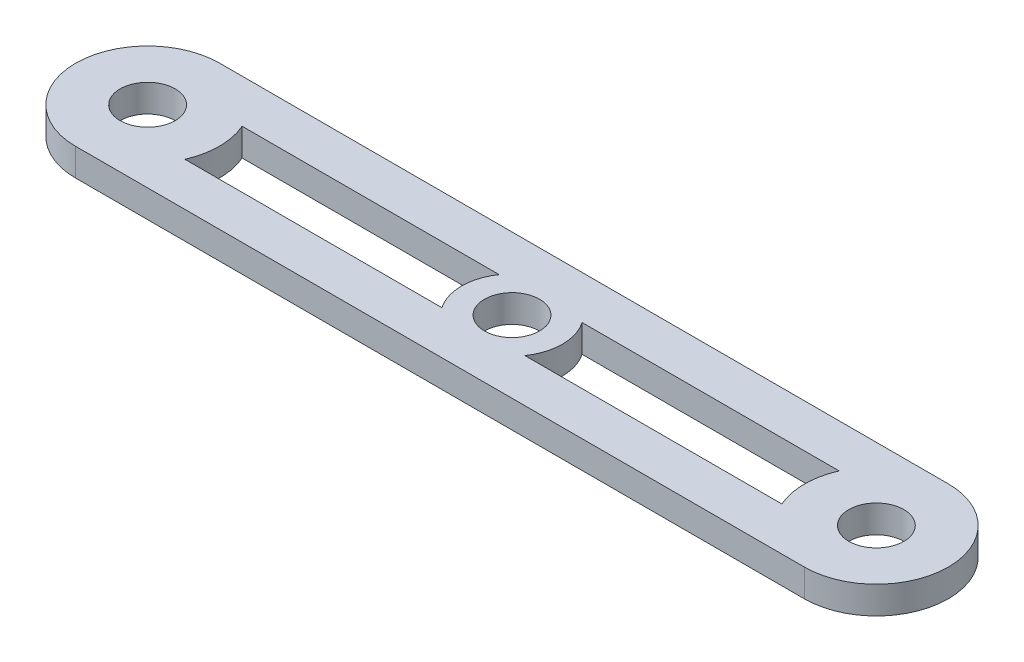
ISO-10303-21;
HEADER;
FILE_DESCRIPTION(('STEP AP214'),'2;1');
FILE_NAME('part.step','',(''),(''),'','','');
FILE_SCHEMA(('AUTOMOTIVE_DESIGN { 1 0 10303 214 1 1 1 1 }'));
ENDSEC;
DATA;
#1=APPLICATION_CONTEXT('core data for automotive mechanical design processes');
#2=APPLICATION_PROTOCOL_DEFINITION('international standard','automotive_design',2000,#1);
#3=PRODUCT_CONTEXT('',#1,'mechanical');
#4=PRODUCT('Part','Part','',(#3));
#5=PRODUCT_RELATED_PRODUCT_CATEGORY('part','',(#4));
#6=PRODUCT_DEFINITION_FORMATION('','',#4);
#7=PRODUCT_DEFINITION_CONTEXT('part definition',#1,'design');
#8=PRODUCT_DEFINITION('design','',#6,#7);
#9=PRODUCT_DEFINITION_SHAPE('','',#8);
#10=(LENGTH_UNIT() NAMED_UNIT(*) SI_UNIT(.MILLI.,.METRE.));
#11=(NAMED_UNIT(*) PLANE_ANGLE_UNIT() SI_UNIT($,.RADIAN.));
#12=(NAMED_UNIT(*) SI_UNIT($,.STERADIAN.) SOLID_ANGLE_UNIT());
#13=UNCERTAINTY_MEASURE_WITH_UNIT(LENGTH_MEASURE(1.E-05),#10,'distance_accuracy_value','');
#14=(GEOMETRIC_REPRESENTATION_CONTEXT(3) GLOBAL_UNCERTAINTY_ASSIGNED_CONTEXT((#13)) GLOBAL_UNIT_ASSIGNED_CONTEXT((#10,
#11,#12)) REPRESENTATION_CONTEXT('',''));
#15=CARTESIAN_POINT('',(0.,0.,0.));
#16=DIRECTION('',(0.,0.,1.));
#17=DIRECTION('',(1.,0.,0.));
#18=AXIS2_PLACEMENT_3D('',#15,#16,#17);
#19=CARTESIAN_POINT('',(0.,0.79375,1.65));
#20=DIRECTION('',(0.,0.,-1.));
#21=DIRECTION('',(-1.,0.,0.));
#22=AXIS2_PLACEMENT_3D('',#19,#20,#21);
#23=PLANE('',#22);
#24=DIRECTION('',(1.,0.,0.));
#25=VECTOR('',#24,1.);
#26=CARTESIAN_POINT('',(0.,-0.79375,1.65));
#27=LINE('',#26,#25);
#28=CARTESIAN_POINT('',(2.3905876376198,-0.79375,1.65));
#29=VERTEX_POINT('',#28);
#30=CARTESIAN_POINT('',(17.2028060915049,-0.79375,1.65));
#31=VERTEX_POINT('',#30);
#32=EDGE_CURVE('E184',#29,#31,#27,.T.);
#33=ORIENTED_EDGE('',*,*,#32,.F.);
#34=DIRECTION('',(0.,-1.,0.));
#35=VECTOR('',#34,1.);
#36=CARTESIAN_POINT('',(2.3905876376198,0.79375,1.65));
#37=LINE('',#36,#35);
#38=CARTESIAN_POINT('',(2.3905876376198,0.79375,1.65));
#39=VERTEX_POINT('',#38);
#40=EDGE_CURVE('E11',#39,#29,#37,.T.);
#41=ORIENTED_EDGE('',*,*,#40,.F.);
#42=DIRECTION('',(1.,0.,0.));
#43=VECTOR('',#42,1.);
#44=CARTESIAN_POINT('',(0.,0.79375,1.65));
#45=LINE('',#44,#43);
#46=CARTESIAN_POINT('',(17.2028060915049,0.79375,1.65));
#47=VERTEX_POINT('',#46);
#48=EDGE_CURVE('E137',#39,#47,#45,.T.);
#49=ORIENTED_EDGE('',*,*,#48,.T.);
#50=DIRECTION('',(0.,-1.,0.));
#51=VECTOR('',#50,1.);
#52=CARTESIAN_POINT('',(17.2028060915049,0.79375,1.65));
#53=LINE('',#52,#51);
#54=EDGE_CURVE('E99',#47,#31,#53,.T.);
#55=ORIENTED_EDGE('',*,*,#54,.T.);
#56=EDGE_LOOP('',(#33,#41,#49,#55));
#57=FACE_BOUND('',#56,.T.);
#58=ADVANCED_FACE('F34',(#57),#23,.T.);
#59=CARTESIAN_POINT('',(0.,0.79375,0.));
#60=DIRECTION('',(0.,-1.,0.));
#61=DIRECTION('',(0.,0.,-1.));
#62=AXIS2_PLACEMENT_3D('',#59,#60,#61);
#63=CYLINDRICAL_SURFACE('',#62,2.90472188912133);
#64=CARTESIAN_POINT('',(0.,-0.79375,0.));
#65=DIRECTION('',(0.,1.,0.));
#66=DIRECTION('',(0.,0.,1.));
#67=AXIS2_PLACEMENT_3D('',#64,#65,#66);
#68=CIRCLE('',#67,2.90472188912133);
#69=CARTESIAN_POINT('',(2.3905876376198,-0.79375,-1.65));
#70=VERTEX_POINT('',#69);
#71=EDGE_CURVE('E143',#29,#70,#68,.T.);
#72=ORIENTED_EDGE('',*,*,#71,.T.);
#73=DIRECTION('',(0.,-1.,0.));
#74=VECTOR('',#73,1.);
#75=CARTESIAN_POINT('',(2.3905876376198,0.79375,-1.65));
#76=LINE('',#75,#74);
#77=CARTESIAN_POINT('',(2.3905876376198,0.79375,-1.65));
#78=VERTEX_POINT('',#77);
#79=EDGE_CURVE('E44',#78,#70,#76,.T.);
#80=ORIENTED_EDGE('',*,*,#79,.F.);
#81=CARTESIAN_POINT('',(0.,0.79375,0.));
#82=DIRECTION('',(0.,1.,0.));
#83=DIRECTION('',(0.,0.,1.));
#84=AXIS2_PLACEMENT_3D('',#81,#82,#83);
#85=CIRCLE('',#84,2.90472188912133);
#86=EDGE_CURVE('E132',#39,#78,#85,.T.);
#87=ORIENTED_EDGE('',*,*,#86,.F.);
#88=ORIENTED_EDGE('',*,*,#40,.T.);
#89=EDGE_LOOP('',(#72,#80,#87,#88));
#90=FACE_BOUND('',#89,.T.);
#91=ADVANCED_FACE('F141',(#90),#63,.T.);
#92=CARTESIAN_POINT('',(0.,0.79375,-1.65));
#93=DIRECTION('',(0.,0.,1.));
#94=DIRECTION('',(1.,0.,0.));
#95=AXIS2_PLACEMENT_3D('',#92,#93,#94);
#96=PLANE('',#95);
#97=DIRECTION('',(-1.,0.,0.));
#98=VECTOR('',#97,1.);
#99=CARTESIAN_POINT('',(0.,-0.79375,-1.65));
#100=LINE('',#99,#98);
#101=CARTESIAN_POINT('',(17.2028060915049,-0.79375,-1.65));
#102=VERTEX_POINT('',#101);
#103=EDGE_CURVE('E188',#102,#70,#100,.T.);
#104=ORIENTED_EDGE('',*,*,#103,.F.);
#105=DIRECTION('',(0.,-1.,0.));
#106=VECTOR('',#105,1.);
#107=CARTESIAN_POINT('',(17.2028060915049,0.79375,-1.65));
#108=LINE('',#107,#106);
#109=CARTESIAN_POINT('',(17.2028060915049,0.79375,-1.65));
#110=VERTEX_POINT('',#109);
#111=EDGE_CURVE('E92',#110,#102,#108,.T.);
#112=ORIENTED_EDGE('',*,*,#111,.F.);
#113=DIRECTION('',(-1.,0.,0.));
#114=VECTOR('',#113,1.);
#115=CARTESIAN_POINT('',(0.,0.79375,-1.65));
#116=LINE('',#115,#114);
#117=EDGE_CURVE('E136',#110,#78,#116,.T.);
#118=ORIENTED_EDGE('',*,*,#117,.T.);
#119=ORIENTED_EDGE('',*,*,#79,.T.);
#120=EDGE_LOOP('',(#104,#112,#118,#119));
#121=FACE_BOUND('',#120,.T.);
#122=ADVANCED_FACE('F148',(#121),#96,.T.);
#123=CARTESIAN_POINT('',(0.,0.79375,4.15));
#124=DIRECTION('',(0.,0.,-1.));
#125=DIRECTION('',(-1.,0.,0.));
#126=AXIS2_PLACEMENT_3D('',#123,#124,#125);
#127=PLANE('',#126);
#128=DIRECTION('',(1.,0.,0.));
#129=VECTOR('',#128,1.);
#130=CARTESIAN_POINT('',(0.,-0.79375,4.15));
#131=LINE('',#130,#129);
#132=CARTESIAN_POINT('',(-21.,-0.79375,4.14999999999999));
#133=VERTEX_POINT('',#132);
#134=CARTESIAN_POINT('',(21.,-0.79375,4.15));
#135=VERTEX_POINT('',#134);
#136=EDGE_CURVE('E175',#133,#135,#131,.T.);
#137=ORIENTED_EDGE('',*,*,#136,.T.);
#138=DIRECTION('',(0.,-1.,0.));
#139=VECTOR('',#138,1.);
#140=CARTESIAN_POINT('',(21.,0.79375,4.15));
#141=LINE('',#140,#139);
#142=CARTESIAN_POINT('',(21.,0.79375,4.15));
#143=VERTEX_POINT('',#142);
#144=EDGE_CURVE('E194',#143,#135,#141,.T.);
#145=ORIENTED_EDGE('',*,*,#144,.F.);
#146=DIRECTION('',(1.,0.,0.));
#147=VECTOR('',#146,1.);
#148=CARTESIAN_POINT('',(0.,0.79375,4.15));
#149=LINE('',#148,#147);
#150=CARTESIAN_POINT('',(-21.,0.79375,4.14999999999999));
#151=VERTEX_POINT('',#150);
#152=EDGE_CURVE('E388',#151,#143,#149,.T.);
#153=ORIENTED_EDGE('',*,*,#152,.F.);
#154=DIRECTION('',(0.,-1.,0.));
#155=VECTOR('',#154,1.);
#156=CARTESIAN_POINT('',(-21.,0.79375,4.14999999999999));
#157=LINE('',#156,#155);
#158=EDGE_CURVE('E196',#151,#133,#157,.T.);
#159=ORIENTED_EDGE('',*,*,#158,.T.);
#160=EDGE_LOOP('',(#137,#145,#153,#159));
#161=FACE_BOUND('',#160,.T.);
#162=ADVANCED_FACE('F256',(#161),#127,.F.);
#163=CARTESIAN_POINT('',(21.,0.79375,0.));
#164=DIRECTION('',(0.,-1.,0.));
#165=DIRECTION('',(0.,0.,-1.));
#166=AXIS2_PLACEMENT_3D('',#163,#164,#165);
#167=CYLINDRICAL_SURFACE('',#166,4.15);
#168=CARTESIAN_POINT('',(21.,-0.79375,0.));
#169=DIRECTION('',(0.,1.,0.));
#170=DIRECTION('',(0.,0.,1.));
#171=AXIS2_PLACEMENT_3D('',#168,#169,#170);
#172=CIRCLE('',#171,4.15);
#173=CARTESIAN_POINT('',(21.,-0.79375,-4.15));
#174=VERTEX_POINT('',#173);
#175=EDGE_CURVE('E178',#135,#174,#172,.T.);
#176=ORIENTED_EDGE('',*,*,#175,.T.);
#177=DIRECTION('',(0.,-1.,0.));
#178=VECTOR('',#177,1.);
#179=CARTESIAN_POINT('',(21.,0.79375,-4.15));
#180=LINE('',#179,#178);
#181=CARTESIAN_POINT('',(21.,0.79375,-4.15));
#182=VERTEX_POINT('',#181);
#183=EDGE_CURVE('E202',#182,#174,#180,.T.);
#184=ORIENTED_EDGE('',*,*,#183,.F.);
#185=CARTESIAN_POINT('',(21.,0.79375,0.));
#186=DIRECTION('',(0.,1.,0.));
#187=DIRECTION('',(0.,0.,1.));
#188=AXIS2_PLACEMENT_3D('',#185,#186,#187);
#189=CIRCLE('',#188,4.15);
#190=EDGE_CURVE('E386',#143,#182,#189,.T.);
#191=ORIENTED_EDGE('',*,*,#190,.F.);
#192=ORIENTED_EDGE('',*,*,#144,.T.);
#193=EDGE_LOOP('',(#176,#184,#191,#192));
#194=FACE_BOUND('',#193,.T.);
#195=ADVANCED_FACE('F252',(#194),#167,.T.);
#196=CARTESIAN_POINT('',(0.,0.79375,-4.15));
#197=DIRECTION('',(0.,0.,1.));
#198=DIRECTION('',(1.,0.,0.));
#199=AXIS2_PLACEMENT_3D('',#196,#197,#198);
#200=PLANE('',#199);
#201=DIRECTION('',(-1.,0.,0.));
#202=VECTOR('',#201,1.);
#203=CARTESIAN_POINT('',(0.,-0.79375,-4.15));
#204=LINE('',#203,#202);
#205=CARTESIAN_POINT('',(-21.,-0.79375,-4.14999999999999));
#206=VERTEX_POINT('',#205);
#207=EDGE_CURVE('E180',#174,#206,#204,.T.);
#208=ORIENTED_EDGE('',*,*,#207,.T.);
#209=DIRECTION('',(0.,-1.,0.));
#210=VECTOR('',#209,1.);
#211=CARTESIAN_POINT('',(-21.,0.79375,-4.14999999999999));
#212=LINE('',#211,#210);
#213=CARTESIAN_POINT('',(-21.,0.79375,-4.14999999999999));
#214=VERTEX_POINT('',#213);
#215=EDGE_CURVE('E199',#214,#206,#212,.T.);
#216=ORIENTED_EDGE('',*,*,#215,.F.);
#217=DIRECTION('',(-1.,0.,0.));
#218=VECTOR('',#217,1.);
#219=CARTESIAN_POINT('',(0.,0.79375,-4.15));
#220=LINE('',#219,#218);
#221=EDGE_CURVE('E382',#182,#214,#220,.T.);
#222=ORIENTED_EDGE('',*,*,#221,.F.);
#223=ORIENTED_EDGE('',*,*,#183,.T.);
#224=EDGE_LOOP('',(#208,#216,#222,#223));
#225=FACE_BOUND('',#224,.T.);
#226=ADVANCED_FACE('F249',(#225),#200,.F.);
#227=CARTESIAN_POINT('',(0.,0.79375,-1.65));
#228=DIRECTION('',(0.,0.,1.));
#229=DIRECTION('',(1.,0.,0.));
#230=AXIS2_PLACEMENT_3D('',#227,#228,#229);
#231=PLANE('',#230);
#232=DIRECTION('',(-1.,0.,0.));
#233=VECTOR('',#232,1.);
#234=CARTESIAN_POINT('',(0.,-0.79375,-1.65));
#235=LINE('',#234,#233);
#236=CARTESIAN_POINT('',(-2.3905876376198,-0.79375,-1.65));
#237=VERTEX_POINT('',#236);
#238=CARTESIAN_POINT('',(-17.2028060915049,-0.79375,-1.65));
#239=VERTEX_POINT('',#238);
#240=EDGE_CURVE('E154',#237,#239,#235,.T.);
#241=ORIENTED_EDGE('',*,*,#240,.F.);
#242=DIRECTION('',(0.,-1.,0.));
#243=VECTOR('',#242,1.);
#244=CARTESIAN_POINT('',(-2.3905876376198,0.79375,-1.65));
#245=LINE('',#244,#243);
#246=CARTESIAN_POINT('',(-2.3905876376198,0.79375,-1.65));
#247=VERTEX_POINT('',#246);
#248=EDGE_CURVE('E38',#247,#237,#245,.T.);
#249=ORIENTED_EDGE('',*,*,#248,.F.);
#250=DIRECTION('',(-1.,0.,0.));
#251=VECTOR('',#250,1.);
#252=CARTESIAN_POINT('',(0.,0.79375,-1.65));
#253=LINE('',#252,#251);
#254=CARTESIAN_POINT('',(-17.2028060915049,0.79375,-1.65));
#255=VERTEX_POINT('',#254);
#256=EDGE_CURVE('E192',#247,#255,#253,.T.);
#257=ORIENTED_EDGE('',*,*,#256,.T.);
#258=DIRECTION('',(0.,-1.,0.));
#259=VECTOR('',#258,1.);
#260=CARTESIAN_POINT('',(-17.2028060915049,0.79375,-1.65));
#261=LINE('',#260,#259);
#262=EDGE_CURVE('E150',#255,#239,#261,.T.);
#263=ORIENTED_EDGE('',*,*,#262,.T.);
#264=EDGE_LOOP('',(#241,#249,#257,#263));
#265=FACE_BOUND('',#264,.T.);
#266=ADVANCED_FACE('F36',(#265),#231,.T.);
#267=CARTESIAN_POINT('',(0.,0.79375,0.));
#268=DIRECTION('',(0.,-1.,0.));
#269=DIRECTION('',(0.,0.,-1.));
#270=AXIS2_PLACEMENT_3D('',#267,#268,#269);
#271=CYLINDRICAL_SURFACE('',#270,2.90472188912133);
#272=CARTESIAN_POINT('',(0.,-0.79375,0.));
#273=DIRECTION('',(0.,1.,0.));
#274=DIRECTION('',(0.,0.,1.));
#275=AXIS2_PLACEMENT_3D('',#272,#273,#274);
#276=CIRCLE('',#275,2.90472188912133);
#277=CARTESIAN_POINT('',(-2.3905876376198,-0.79375,1.65));
#278=VERTEX_POINT('',#277);
#279=EDGE_CURVE('E157',#237,#278,#276,.T.);
#280=ORIENTED_EDGE('',*,*,#279,.T.);
#281=DIRECTION('',(0.,-1.,0.));
#282=VECTOR('',#281,1.);
#283=CARTESIAN_POINT('',(-2.3905876376198,0.79375,1.65));
#284=LINE('',#283,#282);
#285=CARTESIAN_POINT('',(-2.3905876376198,0.79375,1.65));
#286=VERTEX_POINT('',#285);
#287=EDGE_CURVE('E209',#286,#278,#284,.T.);
#288=ORIENTED_EDGE('',*,*,#287,.F.);
#289=CARTESIAN_POINT('',(0.,0.79375,0.));
#290=DIRECTION('',(0.,1.,0.));
#291=DIRECTION('',(0.,0.,1.));
#292=AXIS2_PLACEMENT_3D('',#289,#290,#291);
#293=CIRCLE('',#292,2.90472188912133);
#294=EDGE_CURVE('E217',#247,#286,#293,.T.);
#295=ORIENTED_EDGE('',*,*,#294,.F.);
#296=ORIENTED_EDGE('',*,*,#248,.T.);
#297=EDGE_LOOP('',(#280,#288,#295,#296));
#298=FACE_BOUND('',#297,.T.);
#299=ADVANCED_FACE('F216',(#298),#271,.T.);
#300=CARTESIAN_POINT('',(0.,0.79375,1.65));
#301=DIRECTION('',(0.,0.,-1.));
#302=DIRECTION('',(-1.,0.,0.));
#303=AXIS2_PLACEMENT_3D('',#300,#301,#302);
#304=PLANE('',#303);
#305=DIRECTION('',(1.,0.,0.));
#306=VECTOR('',#305,1.);
#307=CARTESIAN_POINT('',(0.,-0.79375,1.65));
#308=LINE('',#307,#306);
#309=CARTESIAN_POINT('',(-17.2028060915049,-0.79375,1.65));
#310=VERTEX_POINT('',#309);
#311=EDGE_CURVE('E160',#310,#278,#308,.T.);
#312=ORIENTED_EDGE('',*,*,#311,.F.);
#313=DIRECTION('',(0.,-1.,0.));
#314=VECTOR('',#313,1.);
#315=CARTESIAN_POINT('',(-17.2028060915049,0.79375,1.65));
#316=LINE('',#315,#314);
#317=CARTESIAN_POINT('',(-17.2028060915049,0.79375,1.65));
#318=VERTEX_POINT('',#317);
#319=EDGE_CURVE('E208',#318,#310,#316,.T.);
#320=ORIENTED_EDGE('',*,*,#319,.F.);
#321=DIRECTION('',(1.,0.,0.));
#322=VECTOR('',#321,1.);
#323=CARTESIAN_POINT('',(0.,0.79375,1.65));
#324=LINE('',#323,#322);
#325=EDGE_CURVE('E401',#318,#286,#324,.T.);
#326=ORIENTED_EDGE('',*,*,#325,.T.);
#327=ORIENTED_EDGE('',*,*,#287,.T.);
#328=EDGE_LOOP('',(#312,#320,#326,#327));
#329=FACE_BOUND('',#328,.T.);
#330=ADVANCED_FACE('F229',(#329),#304,.T.);
#331=CARTESIAN_POINT('',(-21.,0.79375,0.));
#332=DIRECTION('',(0.,-1.,0.));
#333=DIRECTION('',(0.,0.,-1.));
#334=AXIS2_PLACEMENT_3D('',#331,#332,#333);
#335=CYLINDRICAL_SURFACE('',#334,4.14999999999999);
#336=CARTESIAN_POINT('',(-21.,-0.79375,0.));
#337=DIRECTION('',(0.,1.,0.));
#338=DIRECTION('',(0.,0.,1.));
#339=AXIS2_PLACEMENT_3D('',#336,#337,#338);
#340=CIRCLE('',#339,4.14999999999999);
#341=EDGE_CURVE('E182',#206,#133,#340,.T.);
#342=ORIENTED_EDGE('',*,*,#341,.T.);
#343=ORIENTED_EDGE('',*,*,#158,.F.);
#344=CARTESIAN_POINT('',(-21.,0.79375,0.));
#345=DIRECTION('',(0.,1.,0.));
#346=DIRECTION('',(0.,0.,1.));
#347=AXIS2_PLACEMENT_3D('',#344,#345,#346);
#348=CIRCLE('',#347,4.14999999999999);
#349=EDGE_CURVE('E381',#214,#151,#348,.T.);
#350=ORIENTED_EDGE('',*,*,#349,.F.);
#351=ORIENTED_EDGE('',*,*,#215,.T.);
#352=EDGE_LOOP('',(#342,#343,#350,#351));
#353=FACE_BOUND('',#352,.T.);
#354=ADVANCED_FACE('F231',(#353),#335,.T.);
#355=CARTESIAN_POINT('',(-21.,0.79375,0.));
#356=DIRECTION('',(0.,-1.,0.));
#357=DIRECTION('',(0.,0.,-1.));
#358=AXIS2_PLACEMENT_3D('',#355,#356,#357);
#359=CYLINDRICAL_SURFACE('',#358,1.5875);
#360=CARTESIAN_POINT('',(-21.,0.79375,0.));
#361=DIRECTION('',(0.,1.,0.));
#362=DIRECTION('',(0.,0.,1.));
#363=AXIS2_PLACEMENT_3D('',#360,#361,#362);
#364=CIRCLE('',#363,1.5875);
#365=CARTESIAN_POINT('',(-21.,0.79375,1.5875));
#366=VERTEX_POINT('',#365);
#367=EDGE_CURVE('E391',#366,#366,#364,.T.);
#368=ORIENTED_EDGE('',*,*,#367,.T.);
#369=EDGE_LOOP('',(#368));
#370=FACE_BOUND('',#369,.T.);
#371=CARTESIAN_POINT('',(-21.,-0.79375,0.));
#372=DIRECTION('',(0.,1.,0.));
#373=DIRECTION('',(0.,0.,1.));
#374=AXIS2_PLACEMENT_3D('',#371,#372,#373);
#375=CIRCLE('',#374,1.5875);
#376=CARTESIAN_POINT('',(-21.,-0.79375,1.5875));
#377=VERTEX_POINT('',#376);
#378=EDGE_CURVE('E172',#377,#377,#375,.T.);
#379=ORIENTED_EDGE('',*,*,#378,.F.);
#380=EDGE_LOOP('',(#379));
#381=FACE_BOUND('',#380,.T.);
#382=ADVANCED_FACE('F237',(#370,#381),#359,.F.);
#383=CARTESIAN_POINT('',(21.,0.79375,0.));
#384=DIRECTION('',(0.,-1.,0.));
#385=DIRECTION('',(0.,0.,-1.));
#386=AXIS2_PLACEMENT_3D('',#383,#384,#385);
#387=CYLINDRICAL_SURFACE('',#386,1.5875);
#388=CARTESIAN_POINT('',(21.,0.79375,0.));
#389=DIRECTION('',(0.,1.,0.));
#390=DIRECTION('',(0.,0.,1.));
#391=AXIS2_PLACEMENT_3D('',#388,#389,#390);
#392=CIRCLE('',#391,1.5875);
#393=CARTESIAN_POINT('',(21.,0.79375,1.58749999999999));
#394=VERTEX_POINT('',#393);
#395=EDGE_CURVE('E394',#394,#394,#392,.T.);
#396=ORIENTED_EDGE('',*,*,#395,.T.);
#397=EDGE_LOOP('',(#396));
#398=FACE_BOUND('',#397,.T.);
#399=CARTESIAN_POINT('',(21.,-0.79375,0.));
#400=DIRECTION('',(0.,1.,0.));
#401=DIRECTION('',(0.,0.,1.));
#402=AXIS2_PLACEMENT_3D('',#399,#400,#401);
#403=CIRCLE('',#402,1.5875);
#404=CARTESIAN_POINT('',(21.,-0.79375,1.58749999999999));
#405=VERTEX_POINT('',#404);
#406=EDGE_CURVE('E169',#405,#405,#403,.T.);
#407=ORIENTED_EDGE('',*,*,#406,.F.);
#408=EDGE_LOOP('',(#407));
#409=FACE_BOUND('',#408,.T.);
#410=ADVANCED_FACE('F263',(#398,#409),#387,.F.);
#411=CARTESIAN_POINT('',(0.,0.79375,0.));
#412=DIRECTION('',(0.,-1.,0.));
#413=DIRECTION('',(0.,0.,-1.));
#414=AXIS2_PLACEMENT_3D('',#411,#412,#413);
#415=CYLINDRICAL_SURFACE('',#414,1.5875);
#416=CARTESIAN_POINT('',(0.,0.79375,0.));
#417=DIRECTION('',(0.,1.,0.));
#418=DIRECTION('',(0.,0.,1.));
#419=AXIS2_PLACEMENT_3D('',#416,#417,#418);
#420=CIRCLE('',#419,1.5875);
#421=CARTESIAN_POINT('',(0.,0.79375,1.5875));
#422=VERTEX_POINT('',#421);
#423=EDGE_CURVE('E397',#422,#422,#420,.T.);
#424=ORIENTED_EDGE('',*,*,#423,.T.);
#425=EDGE_LOOP('',(#424));
#426=FACE_BOUND('',#425,.T.);
#427=CARTESIAN_POINT('',(0.,-0.79375,0.));
#428=DIRECTION('',(0.,1.,0.));
#429=DIRECTION('',(0.,0.,1.));
#430=AXIS2_PLACEMENT_3D('',#427,#428,#429);
#431=CIRCLE('',#430,1.5875);
#432=CARTESIAN_POINT('',(0.,-0.79375,1.5875));
#433=VERTEX_POINT('',#432);
#434=EDGE_CURVE('E166',#433,#433,#431,.T.);
#435=ORIENTED_EDGE('',*,*,#434,.F.);
#436=EDGE_LOOP('',(#435));
#437=FACE_BOUND('',#436,.T.);
#438=ADVANCED_FACE('F267',(#426,#437),#415,.F.);
#439=CARTESIAN_POINT('',(-21.,0.79375,0.));
#440=DIRECTION('',(0.,-1.,0.));
#441=DIRECTION('',(0.,0.,-1.));
#442=AXIS2_PLACEMENT_3D('',#439,#440,#441);
#443=CYLINDRICAL_SURFACE('',#442,4.14019100751551);
#444=CARTESIAN_POINT('',(-21.,-0.79375,0.));
#445=DIRECTION('',(0.,1.,0.));
#446=DIRECTION('',(0.,0.,1.));
#447=AXIS2_PLACEMENT_3D('',#444,#445,#446);
#448=CIRCLE('',#447,4.14019100751551);
#449=EDGE_CURVE('E163',#239,#310,#448,.F.);
#450=ORIENTED_EDGE('',*,*,#449,.F.);
#451=ORIENTED_EDGE('',*,*,#262,.F.);
#452=CARTESIAN_POINT('',(-21.,0.79375,0.));
#453=DIRECTION('',(0.,1.,0.));
#454=DIRECTION('',(0.,0.,1.));
#455=AXIS2_PLACEMENT_3D('',#452,#453,#454);
#456=CIRCLE('',#455,4.14019100751551);
#457=EDGE_CURVE('E227',#255,#318,#456,.F.);
#458=ORIENTED_EDGE('',*,*,#457,.T.);
#459=ORIENTED_EDGE('',*,*,#319,.T.);
#460=EDGE_LOOP('',(#450,#451,#458,#459));
#461=FACE_BOUND('',#460,.T.);
#462=ADVANCED_FACE('F226',(#461),#443,.T.);
#463=CARTESIAN_POINT('',(21.,0.79375,0.));
#464=DIRECTION('',(0.,-1.,0.));
#465=DIRECTION('',(0.,0.,-1.));
#466=AXIS2_PLACEMENT_3D('',#463,#464,#465);
#467=CYLINDRICAL_SURFACE('',#466,4.14019100751552);
#468=CARTESIAN_POINT('',(21.,-0.79375,0.));
#469=DIRECTION('',(0.,1.,0.));
#470=DIRECTION('',(0.,0.,1.));
#471=AXIS2_PLACEMENT_3D('',#468,#469,#470);
#472=CIRCLE('',#471,4.14019100751552);
#473=EDGE_CURVE('E190',#102,#31,#472,.T.);
#474=ORIENTED_EDGE('',*,*,#473,.T.);
#475=ORIENTED_EDGE('',*,*,#54,.F.);
#476=CARTESIAN_POINT('',(21.,0.79375,0.));
#477=DIRECTION('',(0.,1.,0.));
#478=DIRECTION('',(0.,0.,1.));
#479=AXIS2_PLACEMENT_3D('',#476,#477,#478);
#480=CIRCLE('',#479,4.14019100751552);
#481=EDGE_CURVE('E53',#110,#47,#480,.T.);
#482=ORIENTED_EDGE('',*,*,#481,.F.);
#483=ORIENTED_EDGE('',*,*,#111,.T.);
#484=EDGE_LOOP('',(#474,#475,#482,#483));
#485=FACE_BOUND('',#484,.T.);
#486=ADVANCED_FACE('F272',(#485),#467,.T.);
#487=CARTESIAN_POINT('',(0.,0.79375,0.));
#488=DIRECTION('',(0.,1.,0.));
#489=DIRECTION('',(0.,0.,1.));
#490=AXIS2_PLACEMENT_3D('',#487,#488,#489);
#491=PLANE('',#490);
#492=ORIENTED_EDGE('',*,*,#256,.F.);
#493=ORIENTED_EDGE('',*,*,#294,.T.);
#494=ORIENTED_EDGE('',*,*,#325,.F.);
#495=ORIENTED_EDGE('',*,*,#457,.F.);
#496=EDGE_LOOP('',(#492,#493,#494,#495));
#497=FACE_BOUND('',#496,.T.);
#498=ORIENTED_EDGE('',*,*,#423,.F.);
#499=EDGE_LOOP('',(#498));
#500=FACE_BOUND('',#499,.T.);
#501=ORIENTED_EDGE('',*,*,#395,.F.);
#502=EDGE_LOOP('',(#501));
#503=FACE_BOUND('',#502,.T.);
#504=ORIENTED_EDGE('',*,*,#367,.F.);
#505=EDGE_LOOP('',(#504));
#506=FACE_BOUND('',#505,.T.);
#507=ORIENTED_EDGE('',*,*,#152,.T.);
#508=ORIENTED_EDGE('',*,*,#190,.T.);
#509=ORIENTED_EDGE('',*,*,#221,.T.);
#510=ORIENTED_EDGE('',*,*,#349,.T.);
#511=EDGE_LOOP('',(#507,#508,#509,#510));
#512=FACE_BOUND('',#511,.T.);
#513=ORIENTED_EDGE('',*,*,#48,.F.);
#514=ORIENTED_EDGE('',*,*,#86,.T.);
#515=ORIENTED_EDGE('',*,*,#117,.F.);
#516=ORIENTED_EDGE('',*,*,#481,.T.);
#517=EDGE_LOOP('',(#513,#514,#515,#516));
#518=FACE_BOUND('',#517,.T.);
#519=ADVANCED_FACE('F134',(#497,#500,#503,#506,#512,#518),#491,.T.);
#520=CARTESIAN_POINT('',(0.,-0.79375,0.));
#521=DIRECTION('',(0.,1.,0.));
#522=DIRECTION('',(0.,0.,1.));
#523=AXIS2_PLACEMENT_3D('',#520,#521,#522);
#524=PLANE('',#523);
#525=ORIENTED_EDGE('',*,*,#240,.T.);
#526=ORIENTED_EDGE('',*,*,#449,.T.);
#527=ORIENTED_EDGE('',*,*,#311,.T.);
#528=ORIENTED_EDGE('',*,*,#279,.F.);
#529=EDGE_LOOP('',(#525,#526,#527,#528));
#530=FACE_BOUND('',#529,.T.);
#531=ORIENTED_EDGE('',*,*,#434,.T.);
#532=EDGE_LOOP('',(#531));
#533=FACE_BOUND('',#532,.T.);
#534=ORIENTED_EDGE('',*,*,#406,.T.);
#535=EDGE_LOOP('',(#534));
#536=FACE_BOUND('',#535,.T.);
#537=ORIENTED_EDGE('',*,*,#378,.T.);
#538=EDGE_LOOP('',(#537));
#539=FACE_BOUND('',#538,.T.);
#540=ORIENTED_EDGE('',*,*,#136,.F.);
#541=ORIENTED_EDGE('',*,*,#341,.F.);
#542=ORIENTED_EDGE('',*,*,#207,.F.);
#543=ORIENTED_EDGE('',*,*,#175,.F.);
#544=EDGE_LOOP('',(#540,#541,#542,#543));
#545=FACE_BOUND('',#544,.T.);
#546=ORIENTED_EDGE('',*,*,#32,.T.);
#547=ORIENTED_EDGE('',*,*,#473,.F.);
#548=ORIENTED_EDGE('',*,*,#103,.T.);
#549=ORIENTED_EDGE('',*,*,#71,.F.);
#550=EDGE_LOOP('',(#546,#547,#548,#549));
#551=FACE_BOUND('',#550,.T.);
#552=ADVANCED_FACE('F220',(#530,#533,#536,#539,#545,#551),#524,.F.);
#553=CLOSED_SHELL('',(#58,#91,#122,#162,#195,#226,#266,#299,#330,#354,#382,#410,#438,#462,#486,
#519,#552));
#554=MANIFOLD_SOLID_BREP('B2',#553);
#555=ADVANCED_BREP_SHAPE_REPRESENTATION('',(#18,#554),#14);
#556=SHAPE_DEFINITION_REPRESENTATION(#9,#555);
ENDSEC;
END-ISO-10303-21;
